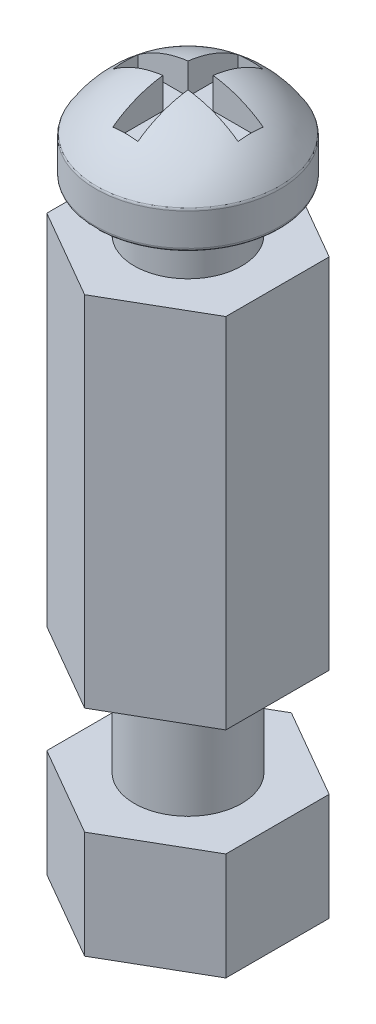
ISO-10303-21;
HEADER;
FILE_DESCRIPTION(('STEP AP214'),'2;1');
FILE_NAME('part.step','',(''),(''),'','','');
FILE_SCHEMA(('AUTOMOTIVE_DESIGN { 1 0 10303 214 1 1 1 1 }'));
ENDSEC;
DATA;
#1=APPLICATION_CONTEXT('core data for automotive mechanical design processes');
#2=APPLICATION_PROTOCOL_DEFINITION('international standard','automotive_design',2000,#1);
#3=PRODUCT_CONTEXT('',#1,'mechanical');
#4=PRODUCT('Part','Part','',(#3));
#5=PRODUCT_RELATED_PRODUCT_CATEGORY('part','',(#4));
#6=PRODUCT_DEFINITION_FORMATION('','',#4);
#7=PRODUCT_DEFINITION_CONTEXT('part definition',#1,'design');
#8=PRODUCT_DEFINITION('design','',#6,#7);
#9=PRODUCT_DEFINITION_SHAPE('','',#8);
#10=(LENGTH_UNIT() NAMED_UNIT(*) SI_UNIT(.MILLI.,.METRE.));
#11=(NAMED_UNIT(*) PLANE_ANGLE_UNIT() SI_UNIT($,.RADIAN.));
#12=(NAMED_UNIT(*) SI_UNIT($,.STERADIAN.) SOLID_ANGLE_UNIT());
#13=UNCERTAINTY_MEASURE_WITH_UNIT(LENGTH_MEASURE(1.E-05),#10,'distance_accuracy_value','');
#14=(GEOMETRIC_REPRESENTATION_CONTEXT(3) GLOBAL_UNCERTAINTY_ASSIGNED_CONTEXT((#13)) GLOBAL_UNIT_ASSIGNED_CONTEXT((#10,
#11,#12)) REPRESENTATION_CONTEXT('',''));
#15=CARTESIAN_POINT('',(0.,0.,0.));
#16=DIRECTION('',(0.,0.,1.));
#17=DIRECTION('',(1.,0.,0.));
#18=AXIS2_PLACEMENT_3D('',#15,#16,#17);
#19=CARTESIAN_POINT('',(2.5,-3.,-1.44337567297407));
#20=DIRECTION('',(1.,0.,0.));
#21=DIRECTION('',(0.,0.,-1.));
#22=AXIS2_PLACEMENT_3D('',#19,#20,#21);
#23=PLANE('',#22);
#24=DIRECTION('',(0.,0.,1.));
#25=VECTOR('',#24,1.);
#26=CARTESIAN_POINT('',(2.5,-6.,-1.44337567297407));
#27=LINE('',#26,#25);
#28=CARTESIAN_POINT('',(2.5,-6.,-1.44337567297407));
#29=VERTEX_POINT('',#28);
#30=CARTESIAN_POINT('',(2.5,-6.,1.44337567297407));
#31=VERTEX_POINT('',#30);
#32=EDGE_CURVE('E136',#29,#31,#27,.T.);
#33=ORIENTED_EDGE('',*,*,#32,.F.);
#34=DIRECTION('',(0.,-1.,0.));
#35=VECTOR('',#34,1.);
#36=CARTESIAN_POINT('',(2.5,-3.,-1.44337567297407));
#37=LINE('',#36,#35);
#38=CARTESIAN_POINT('',(2.5,-3.,-1.44337567297407));
#39=VERTEX_POINT('',#38);
#40=EDGE_CURVE('E12',#39,#29,#37,.T.);
#41=ORIENTED_EDGE('',*,*,#40,.F.);
#42=DIRECTION('',(0.,0.,1.));
#43=VECTOR('',#42,1.);
#44=CARTESIAN_POINT('',(2.5,-3.,-1.44337567297407));
#45=LINE('',#44,#43);
#46=CARTESIAN_POINT('',(2.5,-3.,1.44337567297407));
#47=VERTEX_POINT('',#46);
#48=EDGE_CURVE('E151',#39,#47,#45,.T.);
#49=ORIENTED_EDGE('',*,*,#48,.T.);
#50=DIRECTION('',(0.,-1.,0.));
#51=VECTOR('',#50,1.);
#52=CARTESIAN_POINT('',(2.5,-3.,1.44337567297407));
#53=LINE('',#52,#51);
#54=EDGE_CURVE('E54',#47,#31,#53,.T.);
#55=ORIENTED_EDGE('',*,*,#54,.T.);
#56=EDGE_LOOP('',(#33,#41,#49,#55));
#57=FACE_BOUND('',#56,.T.);
#58=ADVANCED_FACE('F51',(#57),#23,.T.);
#59=CARTESIAN_POINT('',(0.,-3.,-2.88675134594813));
#60=DIRECTION('',(0.5,0.,-0.866025403784439));
#61=DIRECTION('',(-0.866025403784439,0.,-0.5));
#62=AXIS2_PLACEMENT_3D('',#59,#60,#61);
#63=PLANE('',#62);
#64=DIRECTION('',(0.866025403784439,0.,0.5));
#65=VECTOR('',#64,1.);
#66=CARTESIAN_POINT('',(0.,-6.,-2.88675134594813));
#67=LINE('',#66,#65);
#68=CARTESIAN_POINT('',(0.,-6.,-2.88675134594813));
#69=VERTEX_POINT('',#68);
#70=EDGE_CURVE('E149',#69,#29,#67,.T.);
#71=ORIENTED_EDGE('',*,*,#70,.F.);
#72=DIRECTION('',(0.,-1.,0.));
#73=VECTOR('',#72,1.);
#74=CARTESIAN_POINT('',(0.,-3.,-2.88675134594813));
#75=LINE('',#74,#73);
#76=CARTESIAN_POINT('',(0.,-3.,-2.88675134594813));
#77=VERTEX_POINT('',#76);
#78=EDGE_CURVE('E60',#77,#69,#75,.T.);
#79=ORIENTED_EDGE('',*,*,#78,.F.);
#80=DIRECTION('',(0.866025403784439,0.,0.5));
#81=VECTOR('',#80,1.);
#82=CARTESIAN_POINT('',(0.,-3.,-2.88675134594813));
#83=LINE('',#82,#81);
#84=EDGE_CURVE('E126',#77,#39,#83,.T.);
#85=ORIENTED_EDGE('',*,*,#84,.T.);
#86=ORIENTED_EDGE('',*,*,#40,.T.);
#87=EDGE_LOOP('',(#71,#79,#85,#86));
#88=FACE_BOUND('',#87,.T.);
#89=ADVANCED_FACE('F159',(#88),#63,.T.);
#90=CARTESIAN_POINT('',(-2.5,-3.,-1.44337567297406));
#91=DIRECTION('',(-0.5,0.,-0.866025403784439));
#92=DIRECTION('',(-0.866025403784439,0.,0.5));
#93=AXIS2_PLACEMENT_3D('',#90,#91,#92);
#94=PLANE('',#93);
#95=DIRECTION('',(0.866025403784439,0.,-0.5));
#96=VECTOR('',#95,1.);
#97=CARTESIAN_POINT('',(-2.5,-6.,-1.44337567297406));
#98=LINE('',#97,#96);
#99=CARTESIAN_POINT('',(-2.5,-6.,-1.44337567297406));
#100=VERTEX_POINT('',#99);
#101=EDGE_CURVE('E113',#100,#69,#98,.T.);
#102=ORIENTED_EDGE('',*,*,#101,.F.);
#103=DIRECTION('',(0.,-1.,0.));
#104=VECTOR('',#103,1.);
#105=CARTESIAN_POINT('',(-2.5,-3.,-1.44337567297406));
#106=LINE('',#105,#104);
#107=CARTESIAN_POINT('',(-2.5,-3.,-1.44337567297406));
#108=VERTEX_POINT('',#107);
#109=EDGE_CURVE('E108',#108,#100,#106,.T.);
#110=ORIENTED_EDGE('',*,*,#109,.F.);
#111=DIRECTION('',(0.866025403784439,0.,-0.5));
#112=VECTOR('',#111,1.);
#113=CARTESIAN_POINT('',(-2.5,-3.,-1.44337567297406));
#114=LINE('',#113,#112);
#115=EDGE_CURVE('E111',#108,#77,#114,.T.);
#116=ORIENTED_EDGE('',*,*,#115,.T.);
#117=ORIENTED_EDGE('',*,*,#78,.T.);
#118=EDGE_LOOP('',(#102,#110,#116,#117));
#119=FACE_BOUND('',#118,.T.);
#120=ADVANCED_FACE('F110',(#119),#94,.T.);
#121=CARTESIAN_POINT('',(-2.5,-3.,1.44337567297406));
#122=DIRECTION('',(-1.,0.,0.));
#123=DIRECTION('',(0.,0.,1.));
#124=AXIS2_PLACEMENT_3D('',#121,#122,#123);
#125=PLANE('',#124);
#126=DIRECTION('',(0.,0.,-1.));
#127=VECTOR('',#126,1.);
#128=CARTESIAN_POINT('',(-2.5,-6.,1.44337567297406));
#129=LINE('',#128,#127);
#130=CARTESIAN_POINT('',(-2.5,-6.,1.44337567297406));
#131=VERTEX_POINT('',#130);
#132=EDGE_CURVE('E146',#131,#100,#129,.T.);
#133=ORIENTED_EDGE('',*,*,#132,.F.);
#134=DIRECTION('',(0.,-1.,0.));
#135=VECTOR('',#134,1.);
#136=CARTESIAN_POINT('',(-2.5,-3.,1.44337567297406));
#137=LINE('',#136,#135);
#138=CARTESIAN_POINT('',(-2.5,-3.,1.44337567297406));
#139=VERTEX_POINT('',#138);
#140=EDGE_CURVE('E118',#139,#131,#137,.T.);
#141=ORIENTED_EDGE('',*,*,#140,.F.);
#142=DIRECTION('',(0.,0.,-1.));
#143=VECTOR('',#142,1.);
#144=CARTESIAN_POINT('',(-2.5,-3.,1.44337567297406));
#145=LINE('',#144,#143);
#146=EDGE_CURVE('E124',#139,#108,#145,.T.);
#147=ORIENTED_EDGE('',*,*,#146,.T.);
#148=ORIENTED_EDGE('',*,*,#109,.T.);
#149=EDGE_LOOP('',(#133,#141,#147,#148));
#150=FACE_BOUND('',#149,.T.);
#151=ADVANCED_FACE('F128',(#150),#125,.T.);
#152=CARTESIAN_POINT('',(0.,-3.,2.88675134594813));
#153=DIRECTION('',(-0.5,0.,0.866025403784439));
#154=DIRECTION('',(0.866025403784439,0.,0.5));
#155=AXIS2_PLACEMENT_3D('',#152,#153,#154);
#156=PLANE('',#155);
#157=DIRECTION('',(-0.866025403784439,0.,-0.5));
#158=VECTOR('',#157,1.);
#159=CARTESIAN_POINT('',(0.,-6.,2.88675134594813));
#160=LINE('',#159,#158);
#161=CARTESIAN_POINT('',(0.,-6.,2.88675134594813));
#162=VERTEX_POINT('',#161);
#163=EDGE_CURVE('E143',#162,#131,#160,.T.);
#164=ORIENTED_EDGE('',*,*,#163,.F.);
#165=DIRECTION('',(0.,-1.,0.));
#166=VECTOR('',#165,1.);
#167=CARTESIAN_POINT('',(0.,-3.,2.88675134594813));
#168=LINE('',#167,#166);
#169=CARTESIAN_POINT('',(0.,-3.,2.88675134594813));
#170=VERTEX_POINT('',#169);
#171=EDGE_CURVE('E154',#170,#162,#168,.T.);
#172=ORIENTED_EDGE('',*,*,#171,.F.);
#173=DIRECTION('',(-0.866025403784439,0.,-0.5));
#174=VECTOR('',#173,1.);
#175=CARTESIAN_POINT('',(0.,-3.,2.88675134594813));
#176=LINE('',#175,#174);
#177=EDGE_CURVE('E129',#170,#139,#176,.T.);
#178=ORIENTED_EDGE('',*,*,#177,.T.);
#179=ORIENTED_EDGE('',*,*,#140,.T.);
#180=EDGE_LOOP('',(#164,#172,#178,#179));
#181=FACE_BOUND('',#180,.T.);
#182=ADVANCED_FACE('F172',(#181),#156,.T.);
#183=CARTESIAN_POINT('',(2.5,-3.,1.44337567297407));
#184=DIRECTION('',(0.5,0.,0.866025403784439));
#185=DIRECTION('',(0.866025403784439,0.,-0.5));
#186=AXIS2_PLACEMENT_3D('',#183,#184,#185);
#187=PLANE('',#186);
#188=DIRECTION('',(-0.866025403784439,0.,0.5));
#189=VECTOR('',#188,1.);
#190=CARTESIAN_POINT('',(2.5,-6.,1.44337567297407));
#191=LINE('',#190,#189);
#192=EDGE_CURVE('E139',#31,#162,#191,.T.);
#193=ORIENTED_EDGE('',*,*,#192,.F.);
#194=ORIENTED_EDGE('',*,*,#54,.F.);
#195=DIRECTION('',(-0.866025403784439,0.,0.5));
#196=VECTOR('',#195,1.);
#197=CARTESIAN_POINT('',(2.5,-3.,1.44337567297407));
#198=LINE('',#197,#196);
#199=EDGE_CURVE('E131',#47,#170,#198,.T.);
#200=ORIENTED_EDGE('',*,*,#199,.T.);
#201=ORIENTED_EDGE('',*,*,#171,.T.);
#202=EDGE_LOOP('',(#193,#194,#200,#201));
#203=FACE_BOUND('',#202,.T.);
#204=ADVANCED_FACE('F156',(#203),#187,.T.);
#205=CARTESIAN_POINT('',(0.,-3.,0.));
#206=DIRECTION('',(0.,-1.,0.));
#207=DIRECTION('',(0.,0.,-1.));
#208=AXIS2_PLACEMENT_3D('',#205,#206,#207);
#209=PLANE('',#208);
#210=CARTESIAN_POINT('',(0.,-3.,0.));
#211=DIRECTION('',(0.,-1.,0.));
#212=DIRECTION('',(0.,0.,-1.));
#213=AXIS2_PLACEMENT_3D('',#210,#211,#212);
#214=CIRCLE('',#213,1.5);
#215=CARTESIAN_POINT('',(0.,-3.,-1.5));
#216=VERTEX_POINT('',#215);
#217=EDGE_CURVE('E140',#216,#216,#214,.T.);
#218=ORIENTED_EDGE('',*,*,#217,.T.);
#219=EDGE_LOOP('',(#218));
#220=FACE_BOUND('',#219,.T.);
#221=ORIENTED_EDGE('',*,*,#48,.F.);
#222=ORIENTED_EDGE('',*,*,#84,.F.);
#223=ORIENTED_EDGE('',*,*,#115,.F.);
#224=ORIENTED_EDGE('',*,*,#146,.F.);
#225=ORIENTED_EDGE('',*,*,#177,.F.);
#226=ORIENTED_EDGE('',*,*,#199,.F.);
#227=EDGE_LOOP('',(#221,#222,#223,#224,#225,#226));
#228=FACE_BOUND('',#227,.T.);
#229=ADVANCED_FACE('F122',(#220,#228),#209,.F.);
#230=CARTESIAN_POINT('',(0.,-6.,0.));
#231=DIRECTION('',(0.,-1.,0.));
#232=DIRECTION('',(0.,0.,-1.));
#233=AXIS2_PLACEMENT_3D('',#230,#231,#232);
#234=PLANE('',#233);
#235=CARTESIAN_POINT('',(0.,-6.,0.));
#236=DIRECTION('',(0.,-1.,0.));
#237=DIRECTION('',(0.,0.,-1.));
#238=AXIS2_PLACEMENT_3D('',#235,#236,#237);
#239=CIRCLE('',#238,1.5);
#240=CARTESIAN_POINT('',(0.,-6.,-1.5));
#241=VERTEX_POINT('',#240);
#242=EDGE_CURVE('E195',#241,#241,#239,.T.);
#243=ORIENTED_EDGE('',*,*,#242,.F.);
#244=EDGE_LOOP('',(#243));
#245=FACE_BOUND('',#244,.T.);
#246=ORIENTED_EDGE('',*,*,#32,.T.);
#247=ORIENTED_EDGE('',*,*,#192,.T.);
#248=ORIENTED_EDGE('',*,*,#163,.T.);
#249=ORIENTED_EDGE('',*,*,#132,.T.);
#250=ORIENTED_EDGE('',*,*,#101,.T.);
#251=ORIENTED_EDGE('',*,*,#70,.T.);
#252=EDGE_LOOP('',(#246,#247,#248,#249,#250,#251));
#253=FACE_BOUND('',#252,.T.);
#254=ADVANCED_FACE('F158',(#245,#253),#234,.T.);
#255=CARTESIAN_POINT('',(0.,-3.,0.));
#256=DIRECTION('',(0.,-1.,0.));
#257=DIRECTION('',(0.,0.,-1.));
#258=AXIS2_PLACEMENT_3D('',#255,#256,#257);
#259=CYLINDRICAL_SURFACE('',#258,1.5);
#260=ORIENTED_EDGE('',*,*,#217,.F.);
#261=EDGE_LOOP('',(#260));
#262=FACE_BOUND('',#261,.T.);
#263=ORIENTED_EDGE('',*,*,#242,.T.);
#264=EDGE_LOOP('',(#263));
#265=FACE_BOUND('',#264,.T.);
#266=ADVANCED_FACE('F183',(#262,#265),#259,.F.);
#267=CLOSED_SHELL('',(#58,#89,#120,#151,#182,#204,#229,#254,#266));
#268=MANIFOLD_SOLID_BREP('B2',#267);
#269=CARTESIAN_POINT('',(1.25,10.,2.1650635094611));
#270=DIRECTION('',(-0.5,0.,-0.866025403784439));
#271=DIRECTION('',(-0.866025403784439,0.,0.5));
#272=AXIS2_PLACEMENT_3D('',#269,#270,#271);
#273=PLANE('',#272);
#274=DIRECTION('',(0.866025403784439,0.,-0.5));
#275=VECTOR('',#274,1.);
#276=CARTESIAN_POINT('',(1.25,0.,2.1650635094611));
#277=LINE('',#276,#275);
#278=CARTESIAN_POINT('',(0.,0.,2.88675134594813));
#279=VERTEX_POINT('',#278);
#280=CARTESIAN_POINT('',(2.5,0.,1.44337567297407));
#281=VERTEX_POINT('',#280);
#282=EDGE_CURVE('E350',#279,#281,#277,.T.);
#283=ORIENTED_EDGE('',*,*,#282,.T.);
#284=DIRECTION('',(0.,-1.,0.));
#285=VECTOR('',#284,1.);
#286=CARTESIAN_POINT('',(2.5,10.,1.44337567297407));
#287=LINE('',#286,#285);
#288=CARTESIAN_POINT('',(2.5,10.,1.44337567297407));
#289=VERTEX_POINT('',#288);
#290=EDGE_CURVE('E379',#289,#281,#287,.T.);
#291=ORIENTED_EDGE('',*,*,#290,.F.);
#292=DIRECTION('',(0.866025403784439,0.,-0.5));
#293=VECTOR('',#292,1.);
#294=CARTESIAN_POINT('',(1.25,10.,2.1650635094611));
#295=LINE('',#294,#293);
#296=CARTESIAN_POINT('',(0.,10.,2.88675134594813));
#297=VERTEX_POINT('',#296);
#298=EDGE_CURVE('E368',#297,#289,#295,.T.);
#299=ORIENTED_EDGE('',*,*,#298,.F.);
#300=DIRECTION('',(0.,-1.,0.));
#301=VECTOR('',#300,1.);
#302=CARTESIAN_POINT('',(0.,10.,2.88675134594813));
#303=LINE('',#302,#301);
#304=EDGE_CURVE('E346',#297,#279,#303,.T.);
#305=ORIENTED_EDGE('',*,*,#304,.T.);
#306=EDGE_LOOP('',(#283,#291,#299,#305));
#307=FACE_BOUND('',#306,.T.);
#308=ADVANCED_FACE('F248',(#307),#273,.F.);
#309=CARTESIAN_POINT('',(2.5,10.,0.));
#310=DIRECTION('',(-1.,0.,0.));
#311=DIRECTION('',(0.,0.,1.));
#312=AXIS2_PLACEMENT_3D('',#309,#310,#311);
#313=PLANE('',#312);
#314=DIRECTION('',(0.,0.,-1.));
#315=VECTOR('',#314,1.);
#316=CARTESIAN_POINT('',(2.5,0.,0.));
#317=LINE('',#316,#315);
#318=CARTESIAN_POINT('',(2.5,0.,-1.44337567297407));
#319=VERTEX_POINT('',#318);
#320=EDGE_CURVE('E354',#281,#319,#317,.T.);
#321=ORIENTED_EDGE('',*,*,#320,.T.);
#322=DIRECTION('',(0.,-1.,0.));
#323=VECTOR('',#322,1.);
#324=CARTESIAN_POINT('',(2.5,10.,-1.44337567297407));
#325=LINE('',#324,#323);
#326=CARTESIAN_POINT('',(2.5,10.,-1.44337567297407));
#327=VERTEX_POINT('',#326);
#328=EDGE_CURVE('E375',#327,#319,#325,.T.);
#329=ORIENTED_EDGE('',*,*,#328,.F.);
#330=DIRECTION('',(0.,0.,-1.));
#331=VECTOR('',#330,1.);
#332=CARTESIAN_POINT('',(2.5,10.,0.));
#333=LINE('',#332,#331);
#334=EDGE_CURVE('E309',#289,#327,#333,.T.);
#335=ORIENTED_EDGE('',*,*,#334,.F.);
#336=ORIENTED_EDGE('',*,*,#290,.T.);
#337=EDGE_LOOP('',(#321,#329,#335,#336));
#338=FACE_BOUND('',#337,.T.);
#339=ADVANCED_FACE('F448',(#338),#313,.F.);
#340=CARTESIAN_POINT('',(1.25,10.,-2.1650635094611));
#341=DIRECTION('',(-0.5,0.,0.866025403784439));
#342=DIRECTION('',(0.866025403784439,0.,0.5));
#343=AXIS2_PLACEMENT_3D('',#340,#341,#342);
#344=PLANE('',#343);
#345=DIRECTION('',(-0.866025403784439,0.,-0.5));
#346=VECTOR('',#345,1.);
#347=CARTESIAN_POINT('',(1.25,0.,-2.1650635094611));
#348=LINE('',#347,#346);
#349=CARTESIAN_POINT('',(0.,0.,-2.88675134594813));
#350=VERTEX_POINT('',#349);
#351=EDGE_CURVE('E358',#319,#350,#348,.T.);
#352=ORIENTED_EDGE('',*,*,#351,.T.);
#353=DIRECTION('',(0.,-1.,0.));
#354=VECTOR('',#353,1.);
#355=CARTESIAN_POINT('',(0.,10.,-2.88675134594813));
#356=LINE('',#355,#354);
#357=CARTESIAN_POINT('',(0.,10.,-2.88675134594813));
#358=VERTEX_POINT('',#357);
#359=EDGE_CURVE('E339',#358,#350,#356,.T.);
#360=ORIENTED_EDGE('',*,*,#359,.F.);
#361=DIRECTION('',(-0.866025403784439,0.,-0.5));
#362=VECTOR('',#361,1.);
#363=CARTESIAN_POINT('',(1.25,10.,-2.1650635094611));
#364=LINE('',#363,#362);
#365=EDGE_CURVE('E325',#327,#358,#364,.T.);
#366=ORIENTED_EDGE('',*,*,#365,.F.);
#367=ORIENTED_EDGE('',*,*,#328,.T.);
#368=EDGE_LOOP('',(#352,#360,#366,#367));
#369=FACE_BOUND('',#368,.T.);
#370=ADVANCED_FACE('F453',(#369),#344,.F.);
#371=CARTESIAN_POINT('',(-1.25,10.,-2.1650635094611));
#372=DIRECTION('',(0.5,0.,0.866025403784439));
#373=DIRECTION('',(0.866025403784439,0.,-0.5));
#374=AXIS2_PLACEMENT_3D('',#371,#372,#373);
#375=PLANE('',#374);
#376=DIRECTION('',(-0.866025403784439,0.,0.5));
#377=VECTOR('',#376,1.);
#378=CARTESIAN_POINT('',(-1.25,0.,-2.1650635094611));
#379=LINE('',#378,#377);
#380=CARTESIAN_POINT('',(-2.5,0.,-1.44337567297406));
#381=VERTEX_POINT('',#380);
#382=EDGE_CURVE('E335',#350,#381,#379,.T.);
#383=ORIENTED_EDGE('',*,*,#382,.T.);
#384=DIRECTION('',(0.,-1.,0.));
#385=VECTOR('',#384,1.);
#386=CARTESIAN_POINT('',(-2.5,10.,-1.44337567297406));
#387=LINE('',#386,#385);
#388=CARTESIAN_POINT('',(-2.5,10.,-1.44337567297406));
#389=VERTEX_POINT('',#388);
#390=EDGE_CURVE('E332',#389,#381,#387,.T.);
#391=ORIENTED_EDGE('',*,*,#390,.F.);
#392=DIRECTION('',(-0.866025403784439,0.,0.5));
#393=VECTOR('',#392,1.);
#394=CARTESIAN_POINT('',(-1.25,10.,-2.1650635094611));
#395=LINE('',#394,#393);
#396=EDGE_CURVE('E318',#358,#389,#395,.T.);
#397=ORIENTED_EDGE('',*,*,#396,.F.);
#398=ORIENTED_EDGE('',*,*,#359,.T.);
#399=EDGE_LOOP('',(#383,#391,#397,#398));
#400=FACE_BOUND('',#399,.T.);
#401=ADVANCED_FACE('F333',(#400),#375,.F.);
#402=CARTESIAN_POINT('',(-2.5,10.,0.));
#403=DIRECTION('',(1.,0.,0.));
#404=DIRECTION('',(0.,0.,-1.));
#405=AXIS2_PLACEMENT_3D('',#402,#403,#404);
#406=PLANE('',#405);
#407=DIRECTION('',(0.,0.,1.));
#408=VECTOR('',#407,1.);
#409=CARTESIAN_POINT('',(-2.5,0.,0.));
#410=LINE('',#409,#408);
#411=CARTESIAN_POINT('',(-2.5,0.,1.44337567297406));
#412=VERTEX_POINT('',#411);
#413=EDGE_CURVE('E363',#381,#412,#410,.T.);
#414=ORIENTED_EDGE('',*,*,#413,.T.);
#415=DIRECTION('',(0.,-1.,0.));
#416=VECTOR('',#415,1.);
#417=CARTESIAN_POINT('',(-2.5,10.,1.44337567297406));
#418=LINE('',#417,#416);
#419=CARTESIAN_POINT('',(-2.5,10.,1.44337567297406));
#420=VERTEX_POINT('',#419);
#421=EDGE_CURVE('E340',#420,#412,#418,.T.);
#422=ORIENTED_EDGE('',*,*,#421,.F.);
#423=DIRECTION('',(0.,0.,1.));
#424=VECTOR('',#423,1.);
#425=CARTESIAN_POINT('',(-2.5,10.,0.));
#426=LINE('',#425,#424);
#427=EDGE_CURVE('E322',#389,#420,#426,.T.);
#428=ORIENTED_EDGE('',*,*,#427,.F.);
#429=ORIENTED_EDGE('',*,*,#390,.T.);
#430=EDGE_LOOP('',(#414,#422,#428,#429));
#431=FACE_BOUND('',#430,.T.);
#432=ADVANCED_FACE('F342',(#431),#406,.F.);
#433=CARTESIAN_POINT('',(-1.25,10.,2.1650635094611));
#434=DIRECTION('',(0.5,0.,-0.866025403784439));
#435=DIRECTION('',(-0.866025403784439,0.,-0.5));
#436=AXIS2_PLACEMENT_3D('',#433,#434,#435);
#437=PLANE('',#436);
#438=DIRECTION('',(0.866025403784439,0.,0.5));
#439=VECTOR('',#438,1.);
#440=CARTESIAN_POINT('',(-1.25,0.,2.1650635094611));
#441=LINE('',#440,#439);
#442=EDGE_CURVE('E300',#412,#279,#441,.T.);
#443=ORIENTED_EDGE('',*,*,#442,.T.);
#444=ORIENTED_EDGE('',*,*,#304,.F.);
#445=DIRECTION('',(0.866025403784439,0.,0.5));
#446=VECTOR('',#445,1.);
#447=CARTESIAN_POINT('',(-1.25,10.,2.1650635094611));
#448=LINE('',#447,#446);
#449=EDGE_CURVE('E273',#420,#297,#448,.T.);
#450=ORIENTED_EDGE('',*,*,#449,.F.);
#451=ORIENTED_EDGE('',*,*,#421,.T.);
#452=EDGE_LOOP('',(#443,#444,#450,#451));
#453=FACE_BOUND('',#452,.T.);
#454=ADVANCED_FACE('F463',(#453),#437,.F.);
#455=CARTESIAN_POINT('',(0.,10.,0.));
#456=DIRECTION('',(0.,1.,0.));
#457=DIRECTION('',(0.,0.,1.));
#458=AXIS2_PLACEMENT_3D('',#455,#456,#457);
#459=PLANE('',#458);
#460=CARTESIAN_POINT('',(0.,10.,0.));
#461=DIRECTION('',(0.,1.,0.));
#462=DIRECTION('',(-1.,0.,0.));
#463=AXIS2_PLACEMENT_3D('',#460,#461,#462);
#464=CIRCLE('',#463,1.5);
#465=CARTESIAN_POINT('',(-1.5,10.,0.));
#466=VERTEX_POINT('',#465);
#467=EDGE_CURVE('E382',#466,#466,#464,.T.);
#468=ORIENTED_EDGE('',*,*,#467,.F.);
#469=EDGE_LOOP('',(#468));
#470=FACE_BOUND('',#469,.T.);
#471=ORIENTED_EDGE('',*,*,#298,.T.);
#472=ORIENTED_EDGE('',*,*,#334,.T.);
#473=ORIENTED_EDGE('',*,*,#365,.T.);
#474=ORIENTED_EDGE('',*,*,#396,.T.);
#475=ORIENTED_EDGE('',*,*,#427,.T.);
#476=ORIENTED_EDGE('',*,*,#449,.T.);
#477=EDGE_LOOP('',(#471,#472,#473,#474,#475,#476));
#478=FACE_BOUND('',#477,.T.);
#479=ADVANCED_FACE('F320',(#470,#478),#459,.T.);
#480=CARTESIAN_POINT('',(0.,0.,0.));
#481=DIRECTION('',(0.,1.,0.));
#482=DIRECTION('',(0.,0.,1.));
#483=AXIS2_PLACEMENT_3D('',#480,#481,#482);
#484=PLANE('',#483);
#485=CARTESIAN_POINT('',(0.,0.,0.));
#486=DIRECTION('',(0.,1.,0.));
#487=DIRECTION('',(0.,0.,1.));
#488=AXIS2_PLACEMENT_3D('',#485,#486,#487);
#489=CIRCLE('',#488,1.5);
#490=CARTESIAN_POINT('',(0.,0.,1.5));
#491=VERTEX_POINT('',#490);
#492=EDGE_CURVE('E600',#491,#491,#489,.T.);
#493=ORIENTED_EDGE('',*,*,#492,.T.);
#494=EDGE_LOOP('',(#493));
#495=FACE_BOUND('',#494,.T.);
#496=ORIENTED_EDGE('',*,*,#282,.F.);
#497=ORIENTED_EDGE('',*,*,#442,.F.);
#498=ORIENTED_EDGE('',*,*,#413,.F.);
#499=ORIENTED_EDGE('',*,*,#382,.F.);
#500=ORIENTED_EDGE('',*,*,#351,.F.);
#501=ORIENTED_EDGE('',*,*,#320,.F.);
#502=EDGE_LOOP('',(#496,#497,#498,#499,#500,#501));
#503=FACE_BOUND('',#502,.T.);
#504=ADVANCED_FACE('F466',(#495,#503),#484,.F.);
#505=CARTESIAN_POINT('',(0.,-6.,0.));
#506=DIRECTION('',(0.,1.,0.));
#507=DIRECTION('',(0.,0.,1.));
#508=AXIS2_PLACEMENT_3D('',#505,#506,#507);
#509=CYLINDRICAL_SURFACE('',#508,1.5);
#510=CARTESIAN_POINT('',(0.,-6.,0.));
#511=DIRECTION('',(0.,1.,0.));
#512=DIRECTION('',(0.,0.,1.));
#513=AXIS2_PLACEMENT_3D('',#510,#511,#512);
#514=CIRCLE('',#513,1.5);
#515=CARTESIAN_POINT('',(0.,-6.,1.5));
#516=VERTEX_POINT('',#515);
#517=EDGE_CURVE('E355',#516,#516,#514,.T.);
#518=ORIENTED_EDGE('',*,*,#517,.T.);
#519=EDGE_LOOP('',(#518));
#520=FACE_BOUND('',#519,.T.);
#521=ORIENTED_EDGE('',*,*,#492,.F.);
#522=EDGE_LOOP('',(#521));
#523=FACE_BOUND('',#522,.T.);
#524=ADVANCED_FACE('F469',(#520,#523),#509,.T.);
#525=CARTESIAN_POINT('',(0.,-6.,0.));
#526=DIRECTION('',(0.,1.,0.));
#527=DIRECTION('',(0.,0.,1.));
#528=AXIS2_PLACEMENT_3D('',#525,#526,#527);
#529=PLANE('',#528);
#530=ORIENTED_EDGE('',*,*,#517,.F.);
#531=EDGE_LOOP('',(#530));
#532=FACE_BOUND('',#531,.T.);
#533=ADVANCED_FACE('F476',(#532),#529,.F.);
#534=CARTESIAN_POINT('',(0.,10.,0.));
#535=DIRECTION('',(0.,1.,0.));
#536=DIRECTION('',(-1.,0.,0.));
#537=AXIS2_PLACEMENT_3D('',#534,#535,#536);
#538=CYLINDRICAL_SURFACE('',#537,1.5);
#539=CARTESIAN_POINT('',(0.,11.4,0.));
#540=DIRECTION('',(0.,1.,0.));
#541=DIRECTION('',(-1.,0.,0.));
#542=AXIS2_PLACEMENT_3D('',#539,#540,#541);
#543=CIRCLE('',#542,1.5);
#544=CARTESIAN_POINT('',(-1.5,11.4,0.));
#545=VERTEX_POINT('',#544);
#546=EDGE_CURVE('E596',#545,#545,#543,.T.);
#547=ORIENTED_EDGE('',*,*,#546,.F.);
#548=EDGE_LOOP('',(#547));
#549=FACE_BOUND('',#548,.T.);
#550=ORIENTED_EDGE('',*,*,#467,.T.);
#551=EDGE_LOOP('',(#550));
#552=FACE_BOUND('',#551,.T.);
#553=ADVANCED_FACE('F480',(#549,#552),#538,.T.);
#554=CARTESIAN_POINT('',(0.,11.4,0.));
#555=DIRECTION('',(0.,1.,0.));
#556=DIRECTION('',(-1.,0.,0.));
#557=AXIS2_PLACEMENT_3D('',#554,#555,#556);
#558=PLANE('',#557);
#559=CARTESIAN_POINT('',(0.,11.4,0.));
#560=DIRECTION('',(0.,1.,0.));
#561=DIRECTION('',(-1.,0.,0.));
#562=AXIS2_PLACEMENT_3D('',#559,#560,#561);
#563=CIRCLE('',#562,2.47767710879357);
#564=CARTESIAN_POINT('',(-2.47767710879357,11.4,0.));
#565=VERTEX_POINT('',#564);
#566=EDGE_CURVE('E49',#565,#565,#563,.F.);
#567=ORIENTED_EDGE('',*,*,#566,.T.);
#568=EDGE_LOOP('',(#567));
#569=FACE_BOUND('',#568,.T.);
#570=ORIENTED_EDGE('',*,*,#546,.T.);
#571=EDGE_LOOP('',(#570));
#572=FACE_BOUND('',#571,.T.);
#573=ADVANCED_FACE('F484',(#569,#572),#558,.F.);
#574=CARTESIAN_POINT('',(0.,10.,0.));
#575=DIRECTION('',(0.,1.,0.));
#576=DIRECTION('',(-1.,0.,0.));
#577=AXIS2_PLACEMENT_3D('',#574,#575,#576);
#578=CYLINDRICAL_SURFACE('',#577,2.57767710879357);
#579=CARTESIAN_POINT('',(0.,11.5,0.));
#580=DIRECTION('',(0.,1.,0.));
#581=DIRECTION('',(-1.,0.,0.));
#582=AXIS2_PLACEMENT_3D('',#579,#580,#581);
#583=CIRCLE('',#582,2.57767710879357);
#584=CARTESIAN_POINT('',(-2.57767710879357,11.5,0.));
#585=VERTEX_POINT('',#584);
#586=EDGE_CURVE('E257',#585,#585,#583,.T.);
#587=ORIENTED_EDGE('',*,*,#586,.T.);
#588=EDGE_LOOP('',(#587));
#589=FACE_BOUND('',#588,.T.);
#590=CARTESIAN_POINT('',(0.,12.4,0.));
#591=DIRECTION('',(0.,1.,0.));
#592=DIRECTION('',(-1.,0.,0.));
#593=AXIS2_PLACEMENT_3D('',#590,#591,#592);
#594=CIRCLE('',#593,2.57767710879357);
#595=CARTESIAN_POINT('',(-2.57767710879357,12.4,0.));
#596=VERTEX_POINT('',#595);
#597=EDGE_CURVE('E592',#596,#596,#594,.T.);
#598=ORIENTED_EDGE('',*,*,#597,.F.);
#599=EDGE_LOOP('',(#598));
#600=FACE_BOUND('',#599,.T.);
#601=ADVANCED_FACE('F434',(#589,#600),#578,.T.);
#602=CARTESIAN_POINT('',(0.,12.4,0.));
#603=DIRECTION('',(0.,1.,0.));
#604=DIRECTION('',(-1.,0.,0.));
#605=AXIS2_PLACEMENT_3D('',#602,#603,#604);
#606=TOROIDAL_SURFACE('',#605,2.45267710879357,0.125);
#607=CARTESIAN_POINT('',(0.,12.4652173913043,0.));
#608=DIRECTION('',(0.,1.,0.));
#609=DIRECTION('',(-1.,0.,0.));
#610=AXIS2_PLACEMENT_3D('',#607,#608,#609);
#611=CIRCLE('',#610,2.55931524395851);
#612=CARTESIAN_POINT('',(-2.55931524395851,12.4652173913043,0.));
#613=VERTEX_POINT('',#612);
#614=EDGE_CURVE('E561',#613,#613,#611,.T.);
#615=ORIENTED_EDGE('',*,*,#614,.F.);
#616=EDGE_LOOP('',(#615));
#617=FACE_BOUND('',#616,.T.);
#618=ORIENTED_EDGE('',*,*,#597,.T.);
#619=EDGE_LOOP('',(#618));
#620=FACE_BOUND('',#619,.T.);
#621=ADVANCED_FACE('F491',(#617,#620),#606,.T.);
#622=CARTESIAN_POINT('',(0.,10.9,0.));
#623=DIRECTION('',(0.,1.,0.));
#624=DIRECTION('',(1.,0.,0.));
#625=AXIS2_PLACEMENT_3D('',#622,#623,#624);
#626=SPHERICAL_SURFACE('',#625,3.);
#627=CARTESIAN_POINT('',(0.35,10.9,0.));
#628=DIRECTION('',(1.,0.,0.));
#629=DIRECTION('',(0.,0.,-1.));
#630=AXIS2_PLACEMENT_3D('',#627,#628,#629);
#631=CIRCLE('',#630,2.97951338308792);
#632=CARTESIAN_POINT('',(0.35,13.8588849251027,0.35));
#633=VERTEX_POINT('',#632);
#634=CARTESIAN_POINT('',(0.35,13.3114311103575,1.75));
#635=VERTEX_POINT('',#634);
#636=EDGE_CURVE('E383',#633,#635,#631,.T.);
#637=ORIENTED_EDGE('',*,*,#636,.T.);
#638=CARTESIAN_POINT('',(0.,10.9,1.75));
#639=DIRECTION('',(0.,0.,1.));
#640=DIRECTION('',(1.,0.,0.));
#641=AXIS2_PLACEMENT_3D('',#638,#639,#640);
#642=CIRCLE('',#641,2.43669858620224);
#643=CARTESIAN_POINT('',(-0.35,13.3114311103575,1.75));
#644=VERTEX_POINT('',#643);
#645=EDGE_CURVE('E427',#635,#644,#642,.T.);
#646=ORIENTED_EDGE('',*,*,#645,.T.);
#647=CARTESIAN_POINT('',(-0.35,10.9,0.));
#648=DIRECTION('',(1.,0.,0.));
#649=DIRECTION('',(0.,0.,-1.));
#650=AXIS2_PLACEMENT_3D('',#647,#648,#649);
#651=CIRCLE('',#650,2.97951338308792);
#652=CARTESIAN_POINT('',(-0.35,13.8588849251027,0.35));
#653=VERTEX_POINT('',#652);
#654=EDGE_CURVE('E423',#653,#644,#651,.T.);
#655=ORIENTED_EDGE('',*,*,#654,.F.);
#656=CARTESIAN_POINT('',(0.,10.9,0.35));
#657=DIRECTION('',(0.,0.,1.));
#658=DIRECTION('',(1.,0.,0.));
#659=AXIS2_PLACEMENT_3D('',#656,#657,#658);
#660=CIRCLE('',#659,2.97951338308792);
#661=CARTESIAN_POINT('',(-1.75,13.3114311103575,0.35));
#662=VERTEX_POINT('',#661);
#663=EDGE_CURVE('E419',#653,#662,#660,.T.);
#664=ORIENTED_EDGE('',*,*,#663,.T.);
#665=CARTESIAN_POINT('',(-1.75,10.9,0.));
#666=DIRECTION('',(1.,0.,0.));
#667=DIRECTION('',(0.,0.,-1.));
#668=AXIS2_PLACEMENT_3D('',#665,#666,#667);
#669=CIRCLE('',#668,2.43669858620224);
#670=CARTESIAN_POINT('',(-1.75,13.3114311103575,-0.35));
#671=VERTEX_POINT('',#670);
#672=EDGE_CURVE('E415',#671,#662,#669,.T.);
#673=ORIENTED_EDGE('',*,*,#672,.F.);
#674=CARTESIAN_POINT('',(0.,10.9,-0.35));
#675=DIRECTION('',(0.,0.,1.));
#676=DIRECTION('',(1.,0.,0.));
#677=AXIS2_PLACEMENT_3D('',#674,#675,#676);
#678=CIRCLE('',#677,2.97951338308792);
#679=CARTESIAN_POINT('',(-0.35,13.8588849251027,-0.35));
#680=VERTEX_POINT('',#679);
#681=EDGE_CURVE('E411',#680,#671,#678,.T.);
#682=ORIENTED_EDGE('',*,*,#681,.F.);
#683=CARTESIAN_POINT('',(-0.35,10.9,0.));
#684=DIRECTION('',(1.,0.,0.));
#685=DIRECTION('',(0.,0.,-1.));
#686=AXIS2_PLACEMENT_3D('',#683,#684,#685);
#687=CIRCLE('',#686,2.97951338308792);
#688=CARTESIAN_POINT('',(-0.35,13.3114311103575,-1.75));
#689=VERTEX_POINT('',#688);
#690=EDGE_CURVE('E407',#689,#680,#687,.T.);
#691=ORIENTED_EDGE('',*,*,#690,.F.);
#692=CARTESIAN_POINT('',(0.,10.9,-1.75));
#693=DIRECTION('',(0.,0.,1.));
#694=DIRECTION('',(1.,0.,0.));
#695=AXIS2_PLACEMENT_3D('',#692,#693,#694);
#696=CIRCLE('',#695,2.43669858620224);
#697=CARTESIAN_POINT('',(0.35,13.3114311103575,-1.75));
#698=VERTEX_POINT('',#697);
#699=EDGE_CURVE('E403',#698,#689,#696,.T.);
#700=ORIENTED_EDGE('',*,*,#699,.F.);
#701=CARTESIAN_POINT('',(0.35,10.9,0.));
#702=DIRECTION('',(1.,0.,0.));
#703=DIRECTION('',(0.,0.,-1.));
#704=AXIS2_PLACEMENT_3D('',#701,#702,#703);
#705=CIRCLE('',#704,2.97951338308792);
#706=CARTESIAN_POINT('',(0.35,13.8588849251027,-0.35));
#707=VERTEX_POINT('',#706);
#708=EDGE_CURVE('E399',#698,#707,#705,.T.);
#709=ORIENTED_EDGE('',*,*,#708,.T.);
#710=CARTESIAN_POINT('',(0.,10.9,-0.35));
#711=DIRECTION('',(0.,0.,1.));
#712=DIRECTION('',(1.,0.,0.));
#713=AXIS2_PLACEMENT_3D('',#710,#711,#712);
#714=CIRCLE('',#713,2.97951338308792);
#715=CARTESIAN_POINT('',(1.75,13.3114311103575,-0.35));
#716=VERTEX_POINT('',#715);
#717=EDGE_CURVE('E395',#716,#707,#714,.T.);
#718=ORIENTED_EDGE('',*,*,#717,.F.);
#719=CARTESIAN_POINT('',(1.75,10.9,0.));
#720=DIRECTION('',(1.,0.,0.));
#721=DIRECTION('',(0.,0.,-1.));
#722=AXIS2_PLACEMENT_3D('',#719,#720,#721);
#723=CIRCLE('',#722,2.43669858620224);
#724=CARTESIAN_POINT('',(1.75,13.3114311103575,0.35));
#725=VERTEX_POINT('',#724);
#726=EDGE_CURVE('E391',#716,#725,#723,.T.);
#727=ORIENTED_EDGE('',*,*,#726,.T.);
#728=CARTESIAN_POINT('',(0.,10.9,0.35));
#729=DIRECTION('',(0.,0.,1.));
#730=DIRECTION('',(1.,0.,0.));
#731=AXIS2_PLACEMENT_3D('',#728,#729,#730);
#732=CIRCLE('',#731,2.97951338308792);
#733=EDGE_CURVE('E387',#725,#633,#732,.T.);
#734=ORIENTED_EDGE('',*,*,#733,.T.);
#735=EDGE_LOOP('',(#637,#646,#655,#664,#673,#682,#691,#700,#709,#718,#727,#734));
#736=FACE_BOUND('',#735,.T.);
#737=ORIENTED_EDGE('',*,*,#614,.T.);
#738=EDGE_LOOP('',(#737));
#739=FACE_BOUND('',#738,.T.);
#740=ADVANCED_FACE('F494',(#736,#739),#626,.T.);
#741=CARTESIAN_POINT('',(0.,13.,1.75));
#742=DIRECTION('',(0.,0.,1.));
#743=DIRECTION('',(1.,0.,0.));
#744=AXIS2_PLACEMENT_3D('',#741,#742,#743);
#745=PLANE('',#744);
#746=DIRECTION('',(0.,1.,0.));
#747=VECTOR('',#746,1.);
#748=CARTESIAN_POINT('',(0.35,13.,1.75));
#749=LINE('',#748,#747);
#750=CARTESIAN_POINT('',(0.35,13.,1.75));
#751=VERTEX_POINT('',#750);
#752=EDGE_CURVE('E264',#751,#635,#749,.T.);
#753=ORIENTED_EDGE('',*,*,#752,.F.);
#754=DIRECTION('',(1.,0.,0.));
#755=VECTOR('',#754,1.);
#756=CARTESIAN_POINT('',(0.,13.,1.75));
#757=LINE('',#756,#755);
#758=CARTESIAN_POINT('',(-0.35,13.,1.75));
#759=VERTEX_POINT('',#758);
#760=EDGE_CURVE('E559',#759,#751,#757,.T.);
#761=ORIENTED_EDGE('',*,*,#760,.F.);
#762=DIRECTION('',(0.,1.,0.));
#763=VECTOR('',#762,1.);
#764=CARTESIAN_POINT('',(-0.35,13.,1.75));
#765=LINE('',#764,#763);
#766=EDGE_CURVE('E552',#759,#644,#765,.T.);
#767=ORIENTED_EDGE('',*,*,#766,.T.);
#768=ORIENTED_EDGE('',*,*,#645,.F.);
#769=EDGE_LOOP('',(#753,#761,#767,#768));
#770=FACE_BOUND('',#769,.T.);
#771=ADVANCED_FACE('F498',(#770),#745,.F.);
#772=CARTESIAN_POINT('',(-0.35,13.,0.));
#773=DIRECTION('',(1.,0.,0.));
#774=DIRECTION('',(0.,0.,-1.));
#775=AXIS2_PLACEMENT_3D('',#772,#773,#774);
#776=PLANE('',#775);
#777=ORIENTED_EDGE('',*,*,#654,.T.);
#778=ORIENTED_EDGE('',*,*,#766,.F.);
#779=DIRECTION('',(0.,0.,-1.));
#780=VECTOR('',#779,1.);
#781=CARTESIAN_POINT('',(-0.35,13.,0.));
#782=LINE('',#781,#780);
#783=CARTESIAN_POINT('',(-0.35,13.,0.35));
#784=VERTEX_POINT('',#783);
#785=EDGE_CURVE('E585',#759,#784,#782,.T.);
#786=ORIENTED_EDGE('',*,*,#785,.T.);
#787=DIRECTION('',(0.,1.,0.));
#788=VECTOR('',#787,1.);
#789=CARTESIAN_POINT('',(-0.35,13.,0.35));
#790=LINE('',#789,#788);
#791=EDGE_CURVE('E556',#784,#653,#790,.T.);
#792=ORIENTED_EDGE('',*,*,#791,.T.);
#793=EDGE_LOOP('',(#777,#778,#786,#792));
#794=FACE_BOUND('',#793,.T.);
#795=ADVANCED_FACE('F502',(#794),#776,.T.);
#796=CARTESIAN_POINT('',(0.,13.,0.35));
#797=DIRECTION('',(0.,0.,1.));
#798=DIRECTION('',(1.,0.,0.));
#799=AXIS2_PLACEMENT_3D('',#796,#797,#798);
#800=PLANE('',#799);
#801=ORIENTED_EDGE('',*,*,#791,.F.);
#802=DIRECTION('',(1.,0.,0.));
#803=VECTOR('',#802,1.);
#804=CARTESIAN_POINT('',(0.,13.,0.35));
#805=LINE('',#804,#803);
#806=CARTESIAN_POINT('',(-1.75,13.,0.35));
#807=VERTEX_POINT('',#806);
#808=EDGE_CURVE('E649',#807,#784,#805,.T.);
#809=ORIENTED_EDGE('',*,*,#808,.F.);
#810=DIRECTION('',(0.,1.,0.));
#811=VECTOR('',#810,1.);
#812=CARTESIAN_POINT('',(-1.75,13.,0.35));
#813=LINE('',#812,#811);
#814=EDGE_CURVE('E616',#807,#662,#813,.T.);
#815=ORIENTED_EDGE('',*,*,#814,.T.);
#816=ORIENTED_EDGE('',*,*,#663,.F.);
#817=EDGE_LOOP('',(#801,#809,#815,#816));
#818=FACE_BOUND('',#817,.T.);
#819=ADVANCED_FACE('F537',(#818),#800,.F.);
#820=CARTESIAN_POINT('',(-1.75,13.,0.));
#821=DIRECTION('',(1.,0.,0.));
#822=DIRECTION('',(0.,0.,-1.));
#823=AXIS2_PLACEMENT_3D('',#820,#821,#822);
#824=PLANE('',#823);
#825=ORIENTED_EDGE('',*,*,#672,.T.);
#826=ORIENTED_EDGE('',*,*,#814,.F.);
#827=DIRECTION('',(0.,0.,-1.));
#828=VECTOR('',#827,1.);
#829=CARTESIAN_POINT('',(-1.75,13.,0.));
#830=LINE('',#829,#828);
#831=CARTESIAN_POINT('',(-1.75,13.,-0.35));
#832=VERTEX_POINT('',#831);
#833=EDGE_CURVE('E653',#807,#832,#830,.T.);
#834=ORIENTED_EDGE('',*,*,#833,.T.);
#835=DIRECTION('',(0.,1.,0.));
#836=VECTOR('',#835,1.);
#837=CARTESIAN_POINT('',(-1.75,13.,-0.35));
#838=LINE('',#837,#836);
#839=EDGE_CURVE('E620',#832,#671,#838,.T.);
#840=ORIENTED_EDGE('',*,*,#839,.T.);
#841=EDGE_LOOP('',(#825,#826,#834,#840));
#842=FACE_BOUND('',#841,.T.);
#843=ADVANCED_FACE('F533',(#842),#824,.T.);
#844=CARTESIAN_POINT('',(0.,13.,-0.35));
#845=DIRECTION('',(0.,0.,1.));
#846=DIRECTION('',(1.,0.,0.));
#847=AXIS2_PLACEMENT_3D('',#844,#845,#846);
#848=PLANE('',#847);
#849=ORIENTED_EDGE('',*,*,#681,.T.);
#850=ORIENTED_EDGE('',*,*,#839,.F.);
#851=DIRECTION('',(1.,0.,0.));
#852=VECTOR('',#851,1.);
#853=CARTESIAN_POINT('',(0.,13.,-0.35));
#854=LINE('',#853,#852);
#855=CARTESIAN_POINT('',(-0.35,13.,-0.35));
#856=VERTEX_POINT('',#855);
#857=EDGE_CURVE('E657',#832,#856,#854,.T.);
#858=ORIENTED_EDGE('',*,*,#857,.T.);
#859=DIRECTION('',(0.,1.,0.));
#860=VECTOR('',#859,1.);
#861=CARTESIAN_POINT('',(-0.35,13.,-0.35));
#862=LINE('',#861,#860);
#863=EDGE_CURVE('E624',#856,#680,#862,.T.);
#864=ORIENTED_EDGE('',*,*,#863,.T.);
#865=EDGE_LOOP('',(#849,#850,#858,#864));
#866=FACE_BOUND('',#865,.T.);
#867=ADVANCED_FACE('F529',(#866),#848,.T.);
#868=CARTESIAN_POINT('',(-0.35,13.,0.));
#869=DIRECTION('',(1.,0.,0.));
#870=DIRECTION('',(0.,0.,-1.));
#871=AXIS2_PLACEMENT_3D('',#868,#869,#870);
#872=PLANE('',#871);
#873=ORIENTED_EDGE('',*,*,#690,.T.);
#874=ORIENTED_EDGE('',*,*,#863,.F.);
#875=DIRECTION('',(0.,0.,-1.));
#876=VECTOR('',#875,1.);
#877=CARTESIAN_POINT('',(-0.35,13.,0.));
#878=LINE('',#877,#876);
#879=CARTESIAN_POINT('',(-0.35,13.,-1.75));
#880=VERTEX_POINT('',#879);
#881=EDGE_CURVE('E661',#856,#880,#878,.T.);
#882=ORIENTED_EDGE('',*,*,#881,.T.);
#883=DIRECTION('',(0.,1.,0.));
#884=VECTOR('',#883,1.);
#885=CARTESIAN_POINT('',(-0.35,13.,-1.75));
#886=LINE('',#885,#884);
#887=EDGE_CURVE('E628',#880,#689,#886,.T.);
#888=ORIENTED_EDGE('',*,*,#887,.T.);
#889=EDGE_LOOP('',(#873,#874,#882,#888));
#890=FACE_BOUND('',#889,.T.);
#891=ADVANCED_FACE('F525',(#890),#872,.T.);
#892=CARTESIAN_POINT('',(0.,13.,-1.75));
#893=DIRECTION('',(0.,0.,1.));
#894=DIRECTION('',(1.,0.,0.));
#895=AXIS2_PLACEMENT_3D('',#892,#893,#894);
#896=PLANE('',#895);
#897=ORIENTED_EDGE('',*,*,#699,.T.);
#898=ORIENTED_EDGE('',*,*,#887,.F.);
#899=DIRECTION('',(1.,0.,0.));
#900=VECTOR('',#899,1.);
#901=CARTESIAN_POINT('',(0.,13.,-1.75));
#902=LINE('',#901,#900);
#903=CARTESIAN_POINT('',(0.35,13.,-1.75));
#904=VERTEX_POINT('',#903);
#905=EDGE_CURVE('E665',#880,#904,#902,.T.);
#906=ORIENTED_EDGE('',*,*,#905,.T.);
#907=DIRECTION('',(0.,1.,0.));
#908=VECTOR('',#907,1.);
#909=CARTESIAN_POINT('',(0.35,13.,-1.75));
#910=LINE('',#909,#908);
#911=EDGE_CURVE('E632',#904,#698,#910,.T.);
#912=ORIENTED_EDGE('',*,*,#911,.T.);
#913=EDGE_LOOP('',(#897,#898,#906,#912));
#914=FACE_BOUND('',#913,.T.);
#915=ADVANCED_FACE('F521',(#914),#896,.T.);
#916=CARTESIAN_POINT('',(0.35,13.,0.));
#917=DIRECTION('',(1.,0.,0.));
#918=DIRECTION('',(0.,0.,-1.));
#919=AXIS2_PLACEMENT_3D('',#916,#917,#918);
#920=PLANE('',#919);
#921=ORIENTED_EDGE('',*,*,#911,.F.);
#922=DIRECTION('',(0.,0.,-1.));
#923=VECTOR('',#922,1.);
#924=CARTESIAN_POINT('',(0.35,13.,0.));
#925=LINE('',#924,#923);
#926=CARTESIAN_POINT('',(0.35,13.,-0.35));
#927=VERTEX_POINT('',#926);
#928=EDGE_CURVE('E669',#927,#904,#925,.T.);
#929=ORIENTED_EDGE('',*,*,#928,.F.);
#930=DIRECTION('',(0.,1.,0.));
#931=VECTOR('',#930,1.);
#932=CARTESIAN_POINT('',(0.35,13.,-0.35));
#933=LINE('',#932,#931);
#934=EDGE_CURVE('E636',#927,#707,#933,.T.);
#935=ORIENTED_EDGE('',*,*,#934,.T.);
#936=ORIENTED_EDGE('',*,*,#708,.F.);
#937=EDGE_LOOP('',(#921,#929,#935,#936));
#938=FACE_BOUND('',#937,.T.);
#939=ADVANCED_FACE('F517',(#938),#920,.F.);
#940=CARTESIAN_POINT('',(0.,13.,-0.35));
#941=DIRECTION('',(0.,0.,1.));
#942=DIRECTION('',(1.,0.,0.));
#943=AXIS2_PLACEMENT_3D('',#940,#941,#942);
#944=PLANE('',#943);
#945=ORIENTED_EDGE('',*,*,#717,.T.);
#946=ORIENTED_EDGE('',*,*,#934,.F.);
#947=DIRECTION('',(1.,0.,0.));
#948=VECTOR('',#947,1.);
#949=CARTESIAN_POINT('',(0.,13.,-0.35));
#950=LINE('',#949,#948);
#951=CARTESIAN_POINT('',(1.75,13.,-0.35));
#952=VERTEX_POINT('',#951);
#953=EDGE_CURVE('E673',#927,#952,#950,.T.);
#954=ORIENTED_EDGE('',*,*,#953,.T.);
#955=DIRECTION('',(0.,1.,0.));
#956=VECTOR('',#955,1.);
#957=CARTESIAN_POINT('',(1.75,13.,-0.35));
#958=LINE('',#957,#956);
#959=EDGE_CURVE('E583',#952,#716,#958,.T.);
#960=ORIENTED_EDGE('',*,*,#959,.T.);
#961=EDGE_LOOP('',(#945,#946,#954,#960));
#962=FACE_BOUND('',#961,.T.);
#963=ADVANCED_FACE('F513',(#962),#944,.T.);
#964=CARTESIAN_POINT('',(1.75,13.,0.));
#965=DIRECTION('',(1.,0.,0.));
#966=DIRECTION('',(0.,0.,-1.));
#967=AXIS2_PLACEMENT_3D('',#964,#965,#966);
#968=PLANE('',#967);
#969=ORIENTED_EDGE('',*,*,#959,.F.);
#970=DIRECTION('',(0.,0.,-1.));
#971=VECTOR('',#970,1.);
#972=CARTESIAN_POINT('',(1.75,13.,0.));
#973=LINE('',#972,#971);
#974=CARTESIAN_POINT('',(1.75,13.,0.35));
#975=VERTEX_POINT('',#974);
#976=EDGE_CURVE('E676',#975,#952,#973,.T.);
#977=ORIENTED_EDGE('',*,*,#976,.F.);
#978=DIRECTION('',(0.,1.,0.));
#979=VECTOR('',#978,1.);
#980=CARTESIAN_POINT('',(1.75,13.,0.35));
#981=LINE('',#980,#979);
#982=EDGE_CURVE('E579',#975,#725,#981,.T.);
#983=ORIENTED_EDGE('',*,*,#982,.T.);
#984=ORIENTED_EDGE('',*,*,#726,.F.);
#985=EDGE_LOOP('',(#969,#977,#983,#984));
#986=FACE_BOUND('',#985,.T.);
#987=ADVANCED_FACE('F509',(#986),#968,.F.);
#988=CARTESIAN_POINT('',(0.,13.,0.35));
#989=DIRECTION('',(0.,0.,1.));
#990=DIRECTION('',(1.,0.,0.));
#991=AXIS2_PLACEMENT_3D('',#988,#989,#990);
#992=PLANE('',#991);
#993=ORIENTED_EDGE('',*,*,#982,.F.);
#994=DIRECTION('',(1.,0.,0.));
#995=VECTOR('',#994,1.);
#996=CARTESIAN_POINT('',(0.,13.,0.35));
#997=LINE('',#996,#995);
#998=CARTESIAN_POINT('',(0.35,13.,0.35));
#999=VERTEX_POINT('',#998);
#1000=EDGE_CURVE('E576',#999,#975,#997,.T.);
#1001=ORIENTED_EDGE('',*,*,#1000,.F.);
#1002=DIRECTION('',(0.,1.,0.));
#1003=VECTOR('',#1002,1.);
#1004=CARTESIAN_POINT('',(0.35,13.,0.35));
#1005=LINE('',#1004,#1003);
#1006=EDGE_CURVE('E569',#999,#633,#1005,.T.);
#1007=ORIENTED_EDGE('',*,*,#1006,.T.);
#1008=ORIENTED_EDGE('',*,*,#733,.F.);
#1009=EDGE_LOOP('',(#993,#1001,#1007,#1008));
#1010=FACE_BOUND('',#1009,.T.);
#1011=ADVANCED_FACE('F506',(#1010),#992,.F.);
#1012=CARTESIAN_POINT('',(0.35,13.,0.));
#1013=DIRECTION('',(1.,0.,0.));
#1014=DIRECTION('',(0.,0.,-1.));
#1015=AXIS2_PLACEMENT_3D('',#1012,#1013,#1014);
#1016=PLANE('',#1015);
#1017=ORIENTED_EDGE('',*,*,#1006,.F.);
#1018=DIRECTION('',(0.,0.,-1.));
#1019=VECTOR('',#1018,1.);
#1020=CARTESIAN_POINT('',(0.35,13.,0.));
#1021=LINE('',#1020,#1019);
#1022=EDGE_CURVE('E682',#751,#999,#1021,.T.);
#1023=ORIENTED_EDGE('',*,*,#1022,.F.);
#1024=ORIENTED_EDGE('',*,*,#752,.T.);
#1025=ORIENTED_EDGE('',*,*,#636,.F.);
#1026=EDGE_LOOP('',(#1017,#1023,#1024,#1025));
#1027=FACE_BOUND('',#1026,.T.);
#1028=ADVANCED_FACE('F443',(#1027),#1016,.F.);
#1029=CARTESIAN_POINT('',(0.,13.,0.));
#1030=DIRECTION('',(0.,1.,0.));
#1031=DIRECTION('',(0.,0.,1.));
#1032=AXIS2_PLACEMENT_3D('',#1029,#1030,#1031);
#1033=PLANE('',#1032);
#1034=ORIENTED_EDGE('',*,*,#760,.T.);
#1035=ORIENTED_EDGE('',*,*,#1022,.T.);
#1036=ORIENTED_EDGE('',*,*,#1000,.T.);
#1037=ORIENTED_EDGE('',*,*,#976,.T.);
#1038=ORIENTED_EDGE('',*,*,#953,.F.);
#1039=ORIENTED_EDGE('',*,*,#928,.T.);
#1040=ORIENTED_EDGE('',*,*,#905,.F.);
#1041=ORIENTED_EDGE('',*,*,#881,.F.);
#1042=ORIENTED_EDGE('',*,*,#857,.F.);
#1043=ORIENTED_EDGE('',*,*,#833,.F.);
#1044=ORIENTED_EDGE('',*,*,#808,.T.);
#1045=ORIENTED_EDGE('',*,*,#785,.F.);
#1046=EDGE_LOOP('',(#1034,#1035,#1036,#1037,#1038,#1039,#1040,#1041,#1042,#1043,#1044,#1045));
#1047=FACE_BOUND('',#1046,.T.);
#1048=ADVANCED_FACE('F438',(#1047),#1033,.T.);
#1049=CARTESIAN_POINT('',(0.,11.5,0.));
#1050=DIRECTION('',(0.,1.,0.));
#1051=DIRECTION('',(-1.,0.,0.));
#1052=AXIS2_PLACEMENT_3D('',#1049,#1050,#1051);
#1053=TOROIDAL_SURFACE('',#1052,2.47767710879357,0.1);
#1054=ORIENTED_EDGE('',*,*,#566,.F.);
#1055=EDGE_LOOP('',(#1054));
#1056=FACE_BOUND('',#1055,.T.);
#1057=ORIENTED_EDGE('',*,*,#586,.F.);
#1058=EDGE_LOOP('',(#1057));
#1059=FACE_BOUND('',#1058,.T.);
#1060=ADVANCED_FACE('F250',(#1056,#1059),#1053,.T.);
#1061=CLOSED_SHELL('',(#308,#339,#370,#401,#432,#454,#479,#504,#524,#533,#553,#573,#601,#621,
#740,#771,#795,#819,#843,#867,#891,#915,#939,#963,#987,#1011,#1028,#1048,#1060));
#1062=MANIFOLD_SOLID_BREP('B6',#1061);
#1063=ADVANCED_BREP_SHAPE_REPRESENTATION('',(#18,#268,#1062),#14);
#1064=SHAPE_DEFINITION_REPRESENTATION(#9,#1063);
ENDSEC;
END-ISO-10303-21;
